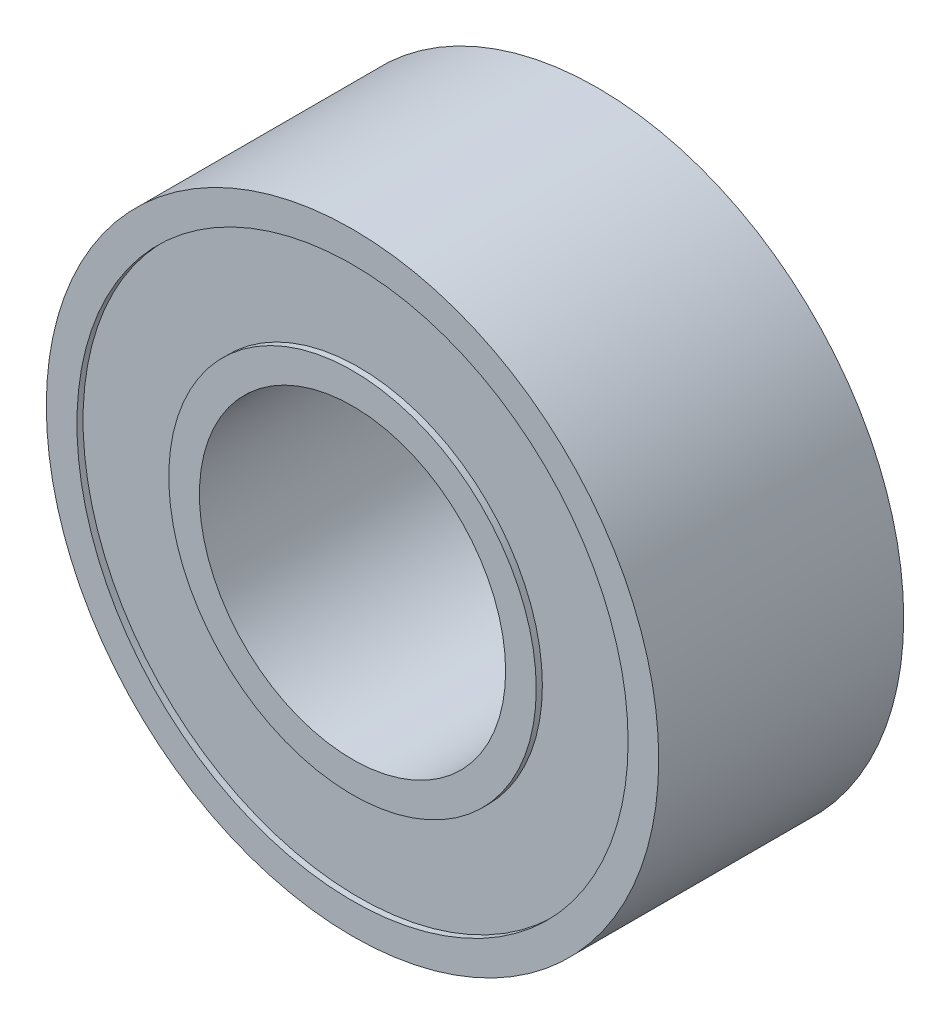
ISO-10303-21;
HEADER;
FILE_DESCRIPTION(('STEP AP214'),'2;1');
FILE_NAME('part.step','',(''),(''),'','','');
FILE_SCHEMA(('AUTOMOTIVE_DESIGN { 1 0 10303 214 1 1 1 1 }'));
ENDSEC;
DATA;
#1=APPLICATION_CONTEXT('core data for automotive mechanical design processes');
#2=APPLICATION_PROTOCOL_DEFINITION('international standard','automotive_design',2000,#1);
#3=PRODUCT_CONTEXT('',#1,'mechanical');
#4=PRODUCT('Part','Part','',(#3));
#5=PRODUCT_RELATED_PRODUCT_CATEGORY('part','',(#4));
#6=PRODUCT_DEFINITION_FORMATION('','',#4);
#7=PRODUCT_DEFINITION_CONTEXT('part definition',#1,'design');
#8=PRODUCT_DEFINITION('design','',#6,#7);
#9=PRODUCT_DEFINITION_SHAPE('','',#8);
#10=(LENGTH_UNIT() NAMED_UNIT(*) SI_UNIT(.MILLI.,.METRE.));
#11=(NAMED_UNIT(*) PLANE_ANGLE_UNIT() SI_UNIT($,.RADIAN.));
#12=(NAMED_UNIT(*) SI_UNIT($,.STERADIAN.) SOLID_ANGLE_UNIT());
#13=UNCERTAINTY_MEASURE_WITH_UNIT(LENGTH_MEASURE(1.E-05),#10,'distance_accuracy_value','');
#14=(GEOMETRIC_REPRESENTATION_CONTEXT(3) GLOBAL_UNCERTAINTY_ASSIGNED_CONTEXT((#13)) GLOBAL_UNIT_ASSIGNED_CONTEXT((#10,
#11,#12)) REPRESENTATION_CONTEXT('',''));
#15=CARTESIAN_POINT('',(0.,0.,0.));
#16=DIRECTION('',(0.,0.,1.));
#17=DIRECTION('',(1.,0.,0.));
#18=AXIS2_PLACEMENT_3D('',#15,#16,#17);
#19=CARTESIAN_POINT('',(0.,0.,-2.));
#20=DIRECTION('',(0.,0.,1.));
#21=DIRECTION('',(1.,0.,0.));
#22=AXIS2_PLACEMENT_3D('',#19,#20,#21);
#23=PLANE('',#22);
#24=CARTESIAN_POINT('',(0.,0.,-2.));
#25=DIRECTION('',(0.,0.,1.));
#26=DIRECTION('',(1.,0.,0.));
#27=AXIS2_PLACEMENT_3D('',#24,#25,#26);
#28=CIRCLE('',#27,2.5);
#29=CARTESIAN_POINT('',(2.5,0.,-2.));
#30=VERTEX_POINT('',#29);
#31=EDGE_CURVE('E49',#30,#30,#28,.T.);
#32=ORIENTED_EDGE('',*,*,#31,.T.);
#33=EDGE_LOOP('',(#32));
#34=FACE_BOUND('',#33,.T.);
#35=CARTESIAN_POINT('',(0.,0.,-2.));
#36=DIRECTION('',(0.,0.,1.));
#37=DIRECTION('',(1.,0.,0.));
#38=AXIS2_PLACEMENT_3D('',#35,#36,#37);
#39=CIRCLE('',#38,3.);
#40=CARTESIAN_POINT('',(3.,0.,-2.));
#41=VERTEX_POINT('',#40);
#42=EDGE_CURVE('E74',#41,#41,#39,.T.);
#43=ORIENTED_EDGE('',*,*,#42,.F.);
#44=EDGE_LOOP('',(#43));
#45=FACE_BOUND('',#44,.T.);
#46=ADVANCED_FACE('F40',(#34,#45),#23,.F.);
#47=CARTESIAN_POINT('',(0.,0.,2.));
#48=DIRECTION('',(0.,0.,1.));
#49=DIRECTION('',(1.,0.,0.));
#50=AXIS2_PLACEMENT_3D('',#47,#48,#49);
#51=PLANE('',#50);
#52=CARTESIAN_POINT('',(0.,0.,2.));
#53=DIRECTION('',(0.,0.,1.));
#54=DIRECTION('',(1.,0.,0.));
#55=AXIS2_PLACEMENT_3D('',#52,#53,#54);
#56=CIRCLE('',#55,2.5);
#57=CARTESIAN_POINT('',(2.5,0.,2.));
#58=VERTEX_POINT('',#57);
#59=EDGE_CURVE('E48',#58,#58,#56,.T.);
#60=ORIENTED_EDGE('',*,*,#59,.F.);
#61=EDGE_LOOP('',(#60));
#62=FACE_BOUND('',#61,.T.);
#63=CARTESIAN_POINT('',(0.,0.,2.));
#64=DIRECTION('',(0.,0.,1.));
#65=DIRECTION('',(1.,0.,0.));
#66=AXIS2_PLACEMENT_3D('',#63,#64,#65);
#67=CIRCLE('',#66,3.);
#68=CARTESIAN_POINT('',(3.,0.,2.));
#69=VERTEX_POINT('',#68);
#70=EDGE_CURVE('E64',#69,#69,#67,.T.);
#71=ORIENTED_EDGE('',*,*,#70,.T.);
#72=EDGE_LOOP('',(#71));
#73=FACE_BOUND('',#72,.T.);
#74=ADVANCED_FACE('F89',(#62,#73),#51,.T.);
#75=CARTESIAN_POINT('',(0.,0.,2.));
#76=DIRECTION('',(0.,0.,1.));
#77=DIRECTION('',(1.,0.,0.));
#78=AXIS2_PLACEMENT_3D('',#75,#76,#77);
#79=CIRCLE('',#78,4.5);
#80=CARTESIAN_POINT('',(4.5,0.,2.));
#81=VERTEX_POINT('',#80);
#82=EDGE_CURVE('E57',#81,#81,#79,.T.);
#83=ORIENTED_EDGE('',*,*,#82,.F.);
#84=EDGE_LOOP('',(#83));
#85=FACE_BOUND('',#84,.T.);
#86=CARTESIAN_POINT('',(0.,0.,2.));
#87=DIRECTION('',(0.,0.,1.));
#88=DIRECTION('',(1.,0.,0.));
#89=AXIS2_PLACEMENT_3D('',#86,#87,#88);
#90=CIRCLE('',#89,5.);
#91=CARTESIAN_POINT('',(5.,0.,2.));
#92=VERTEX_POINT('',#91);
#93=EDGE_CURVE('E10',#92,#92,#90,.T.);
#94=ORIENTED_EDGE('',*,*,#93,.T.);
#95=EDGE_LOOP('',(#94));
#96=FACE_BOUND('',#95,.T.);
#97=ADVANCED_FACE('F98',(#85,#96),#51,.T.);
#98=CARTESIAN_POINT('',(0.,0.,-2.));
#99=DIRECTION('',(0.,0.,1.));
#100=DIRECTION('',(1.,0.,0.));
#101=AXIS2_PLACEMENT_3D('',#98,#99,#100);
#102=CIRCLE('',#101,4.5);
#103=CARTESIAN_POINT('',(4.5,0.,-2.));
#104=VERTEX_POINT('',#103);
#105=EDGE_CURVE('E67',#104,#104,#102,.T.);
#106=ORIENTED_EDGE('',*,*,#105,.T.);
#107=EDGE_LOOP('',(#106));
#108=FACE_BOUND('',#107,.T.);
#109=CARTESIAN_POINT('',(0.,0.,-2.));
#110=DIRECTION('',(0.,0.,1.));
#111=DIRECTION('',(1.,0.,0.));
#112=AXIS2_PLACEMENT_3D('',#109,#110,#111);
#113=CIRCLE('',#112,5.);
#114=CARTESIAN_POINT('',(5.,0.,-2.));
#115=VERTEX_POINT('',#114);
#116=EDGE_CURVE('E41',#115,#115,#113,.T.);
#117=ORIENTED_EDGE('',*,*,#116,.F.);
#118=EDGE_LOOP('',(#117));
#119=FACE_BOUND('',#118,.T.);
#120=ADVANCED_FACE('F95',(#108,#119),#23,.F.);
#121=CARTESIAN_POINT('',(0.,0.,2.));
#122=DIRECTION('',(0.,0.,-1.));
#123=DIRECTION('',(-1.,0.,0.));
#124=AXIS2_PLACEMENT_3D('',#121,#122,#123);
#125=CYLINDRICAL_SURFACE('',#124,5.);
#126=ORIENTED_EDGE('',*,*,#93,.F.);
#127=EDGE_LOOP('',(#126));
#128=FACE_BOUND('',#127,.T.);
#129=ORIENTED_EDGE('',*,*,#116,.T.);
#130=EDGE_LOOP('',(#129));
#131=FACE_BOUND('',#130,.T.);
#132=ADVANCED_FACE('F39',(#128,#131),#125,.T.);
#133=CARTESIAN_POINT('',(0.,0.,2.));
#134=DIRECTION('',(0.,0.,-1.));
#135=DIRECTION('',(-1.,0.,0.));
#136=AXIS2_PLACEMENT_3D('',#133,#134,#135);
#137=CYLINDRICAL_SURFACE('',#136,2.5);
#138=ORIENTED_EDGE('',*,*,#59,.T.);
#139=EDGE_LOOP('',(#138));
#140=FACE_BOUND('',#139,.T.);
#141=ORIENTED_EDGE('',*,*,#31,.F.);
#142=EDGE_LOOP('',(#141));
#143=FACE_BOUND('',#142,.T.);
#144=ADVANCED_FACE('F106',(#140,#143),#137,.F.);
#145=CARTESIAN_POINT('',(0.,0.,1.9));
#146=DIRECTION('',(0.,0.,1.));
#147=DIRECTION('',(1.,0.,0.));
#148=AXIS2_PLACEMENT_3D('',#145,#146,#147);
#149=CYLINDRICAL_SURFACE('',#148,4.5);
#150=CARTESIAN_POINT('',(0.,0.,1.9));
#151=DIRECTION('',(0.,0.,1.));
#152=DIRECTION('',(1.,0.,0.));
#153=AXIS2_PLACEMENT_3D('',#150,#151,#152);
#154=CIRCLE('',#153,4.5);
#155=CARTESIAN_POINT('',(4.5,0.,1.9));
#156=VERTEX_POINT('',#155);
#157=EDGE_CURVE('E52',#156,#156,#154,.T.);
#158=ORIENTED_EDGE('',*,*,#157,.F.);
#159=EDGE_LOOP('',(#158));
#160=FACE_BOUND('',#159,.T.);
#161=ORIENTED_EDGE('',*,*,#82,.T.);
#162=EDGE_LOOP('',(#161));
#163=FACE_BOUND('',#162,.T.);
#164=ADVANCED_FACE('F129',(#160,#163),#149,.F.);
#165=CARTESIAN_POINT('',(0.,0.,1.9));
#166=DIRECTION('',(0.,0.,1.));
#167=DIRECTION('',(1.,0.,0.));
#168=AXIS2_PLACEMENT_3D('',#165,#166,#167);
#169=PLANE('',#168);
#170=CARTESIAN_POINT('',(0.,0.,1.9));
#171=DIRECTION('',(0.,0.,1.));
#172=DIRECTION('',(1.,0.,0.));
#173=AXIS2_PLACEMENT_3D('',#170,#171,#172);
#174=CIRCLE('',#173,3.);
#175=CARTESIAN_POINT('',(3.,0.,1.9));
#176=VERTEX_POINT('',#175);
#177=EDGE_CURVE('E56',#176,#176,#174,.T.);
#178=ORIENTED_EDGE('',*,*,#177,.F.);
#179=EDGE_LOOP('',(#178));
#180=FACE_BOUND('',#179,.T.);
#181=ORIENTED_EDGE('',*,*,#157,.T.);
#182=EDGE_LOOP('',(#181));
#183=FACE_BOUND('',#182,.T.);
#184=ADVANCED_FACE('F124',(#180,#183),#169,.T.);
#185=CARTESIAN_POINT('',(0.,0.,1.9));
#186=DIRECTION('',(0.,0.,1.));
#187=DIRECTION('',(1.,0.,0.));
#188=AXIS2_PLACEMENT_3D('',#185,#186,#187);
#189=CYLINDRICAL_SURFACE('',#188,3.);
#190=ORIENTED_EDGE('',*,*,#177,.T.);
#191=EDGE_LOOP('',(#190));
#192=FACE_BOUND('',#191,.T.);
#193=ORIENTED_EDGE('',*,*,#70,.F.);
#194=EDGE_LOOP('',(#193));
#195=FACE_BOUND('',#194,.T.);
#196=ADVANCED_FACE('F116',(#192,#195),#189,.T.);
#197=CARTESIAN_POINT('',(0.,0.,-1.9));
#198=DIRECTION('',(0.,0.,-1.));
#199=DIRECTION('',(1.,0.,0.));
#200=AXIS2_PLACEMENT_3D('',#197,#198,#199);
#201=PLANE('',#200);
#202=CARTESIAN_POINT('',(0.,0.,-1.9));
#203=DIRECTION('',(0.,0.,1.));
#204=DIRECTION('',(1.,0.,0.));
#205=AXIS2_PLACEMENT_3D('',#202,#203,#204);
#206=CIRCLE('',#205,4.5);
#207=CARTESIAN_POINT('',(4.5,0.,-1.9));
#208=VERTEX_POINT('',#207);
#209=EDGE_CURVE('E61',#208,#208,#206,.T.);
#210=ORIENTED_EDGE('',*,*,#209,.F.);
#211=EDGE_LOOP('',(#210));
#212=FACE_BOUND('',#211,.T.);
#213=CARTESIAN_POINT('',(0.,0.,-1.9));
#214=DIRECTION('',(0.,0.,1.));
#215=DIRECTION('',(1.,0.,0.));
#216=AXIS2_PLACEMENT_3D('',#213,#214,#215);
#217=CIRCLE('',#216,3.);
#218=CARTESIAN_POINT('',(3.,0.,-1.9));
#219=VERTEX_POINT('',#218);
#220=EDGE_CURVE('E72',#219,#219,#217,.T.);
#221=ORIENTED_EDGE('',*,*,#220,.T.);
#222=EDGE_LOOP('',(#221));
#223=FACE_BOUND('',#222,.T.);
#224=ADVANCED_FACE('F76',(#212,#223),#201,.T.);
#225=CARTESIAN_POINT('',(0.,0.,-1.9));
#226=DIRECTION('',(0.,0.,-1.));
#227=DIRECTION('',(-1.,0.,0.));
#228=AXIS2_PLACEMENT_3D('',#225,#226,#227);
#229=CYLINDRICAL_SURFACE('',#228,4.5);
#230=ORIENTED_EDGE('',*,*,#209,.T.);
#231=EDGE_LOOP('',(#230));
#232=FACE_BOUND('',#231,.T.);
#233=ORIENTED_EDGE('',*,*,#105,.F.);
#234=EDGE_LOOP('',(#233));
#235=FACE_BOUND('',#234,.T.);
#236=ADVANCED_FACE('F84',(#232,#235),#229,.F.);
#237=CARTESIAN_POINT('',(0.,0.,-1.9));
#238=DIRECTION('',(0.,0.,-1.));
#239=DIRECTION('',(-1.,0.,0.));
#240=AXIS2_PLACEMENT_3D('',#237,#238,#239);
#241=CYLINDRICAL_SURFACE('',#240,3.);
#242=ORIENTED_EDGE('',*,*,#220,.F.);
#243=EDGE_LOOP('',(#242));
#244=FACE_BOUND('',#243,.T.);
#245=ORIENTED_EDGE('',*,*,#42,.T.);
#246=EDGE_LOOP('',(#245));
#247=FACE_BOUND('',#246,.T.);
#248=ADVANCED_FACE('F85',(#244,#247),#241,.T.);
#249=CLOSED_SHELL('',(#46,#74,#97,#120,#132,#144,#164,#184,#196,#224,#236,#248));
#250=MANIFOLD_SOLID_BREP('B2',#249);
#251=ADVANCED_BREP_SHAPE_REPRESENTATION('',(#18,#250),#14);
#252=SHAPE_DEFINITION_REPRESENTATION(#9,#251);
ENDSEC;
END-ISO-10303-21;
